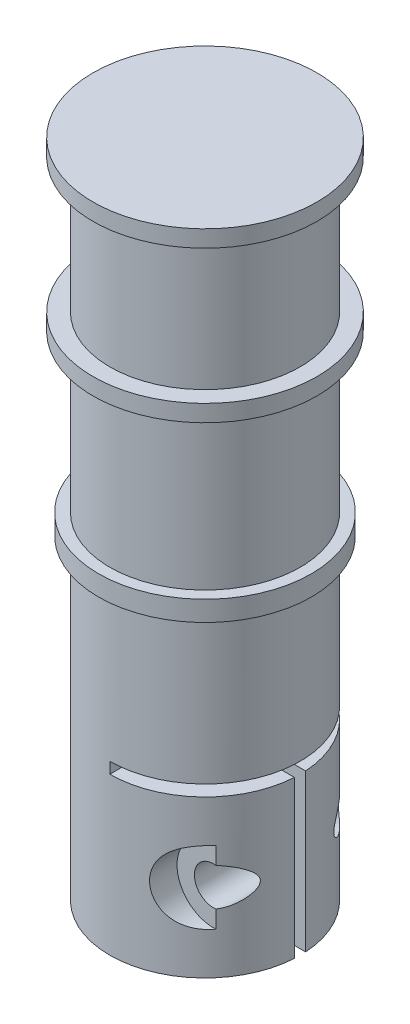
ISO-10303-21;
HEADER;
FILE_DESCRIPTION(('STEP AP214'),'2;1');
FILE_NAME('part.step','',(''),(''),'','','');
FILE_SCHEMA(('AUTOMOTIVE_DESIGN { 1 0 10303 214 1 1 1 1 }'));
ENDSEC;
DATA;
#1=APPLICATION_CONTEXT('core data for automotive mechanical design processes');
#2=APPLICATION_PROTOCOL_DEFINITION('international standard','automotive_design',2000,#1);
#3=PRODUCT_CONTEXT('',#1,'mechanical');
#4=PRODUCT('Part','Part','',(#3));
#5=PRODUCT_RELATED_PRODUCT_CATEGORY('part','',(#4));
#6=PRODUCT_DEFINITION_FORMATION('','',#4);
#7=PRODUCT_DEFINITION_CONTEXT('part definition',#1,'design');
#8=PRODUCT_DEFINITION('design','',#6,#7);
#9=PRODUCT_DEFINITION_SHAPE('','',#8);
#10=(LENGTH_UNIT() NAMED_UNIT(*) SI_UNIT(.MILLI.,.METRE.));
#11=(NAMED_UNIT(*) PLANE_ANGLE_UNIT() SI_UNIT($,.RADIAN.));
#12=(NAMED_UNIT(*) SI_UNIT($,.STERADIAN.) SOLID_ANGLE_UNIT());
#13=UNCERTAINTY_MEASURE_WITH_UNIT(LENGTH_MEASURE(1.E-05),#10,'distance_accuracy_value','');
#14=(GEOMETRIC_REPRESENTATION_CONTEXT(3) GLOBAL_UNCERTAINTY_ASSIGNED_CONTEXT((#13)) GLOBAL_UNIT_ASSIGNED_CONTEXT((#10,
#11,#12)) REPRESENTATION_CONTEXT('',''));
#15=CARTESIAN_POINT('',(0.,0.,0.));
#16=DIRECTION('',(0.,0.,1.));
#17=DIRECTION('',(1.,0.,0.));
#18=AXIS2_PLACEMENT_3D('',#15,#16,#17);
#19=CARTESIAN_POINT('',(0.,15.,0.));
#20=DIRECTION('',(0.,1.,0.));
#21=DIRECTION('',(-1.,0.,0.));
#22=AXIS2_PLACEMENT_3D('',#19,#20,#21);
#23=CYLINDRICAL_SURFACE('',#22,8.49999999999999);
#24=CARTESIAN_POINT('',(7.49999999999999,-37.,-4.));
#25=CARTESIAN_POINT('',(7.50000104173106,-37.0362621084396,-3.99999781244888));
#26=CARTESIAN_POINT('',(7.49840667362942,-37.0725178735861,-4.00299165296323));
#27=CARTESIAN_POINT('',(7.4922112444708,-37.1438669581623,-4.01457496538662));
#28=CARTESIAN_POINT('',(7.48760654982766,-37.1789588188573,-4.02317119957305));
#29=CARTESIAN_POINT('',(7.47421892105926,-37.2563609485364,-4.04799895786751));
#30=CARTESIAN_POINT('',(7.46464402000119,-37.2980652831181,-4.06566450341244));
#31=CARTESIAN_POINT('',(7.44227788080236,-37.3777505180664,-4.10646370496002));
#32=CARTESIAN_POINT('',(7.42947955493187,-37.4157229534613,-4.12960940402044));
#33=CARTESIAN_POINT('',(7.39212753270202,-37.5120774238403,-4.19627210145248));
#34=CARTESIAN_POINT('',(7.3654086042779,-37.5672832733205,-4.24311553758888));
#35=CARTESIAN_POINT('',(7.30726581959389,-37.6694405690026,-4.34249017554281));
#36=CARTESIAN_POINT('',(7.27582834977834,-37.7163672474147,-4.39503770879502));
#37=CARTESIAN_POINT('',(7.21228202415956,-37.7993646960558,-4.49848181530906));
#38=CARTESIAN_POINT('',(7.1804894962976,-37.8360328690112,-4.54909978569364));
#39=CARTESIAN_POINT('',(7.11425252927633,-37.9043409617399,-4.65200614975663));
#40=CARTESIAN_POINT('',(7.07980608442306,-37.935977022058,-4.70429578898584));
#41=CARTESIAN_POINT('',(7.00850601757651,-37.9946354883093,-4.80987585764598));
#42=CARTESIAN_POINT('',(6.97165042416338,-38.0216540486889,-4.86316708061864));
#43=CARTESIAN_POINT('',(6.89571735445522,-38.0712638567762,-4.97025098716958));
#44=CARTESIAN_POINT('',(6.85663901555579,-38.0938533703235,-5.02404385856329));
#45=CARTESIAN_POINT('',(6.77384906822523,-38.1359459087546,-5.13517915096006));
#46=CARTESIAN_POINT('',(6.73000086915312,-38.1551609959873,-5.19252958775169));
#47=CARTESIAN_POINT('',(6.6401163129894,-38.1885318357772,-5.30699261806551));
#48=CARTESIAN_POINT('',(6.59407912472238,-38.2026856488671,-5.36410511214082));
#49=CARTESIAN_POINT('',(6.45305541606281,-38.2371879924718,-5.53440723394654));
#50=CARTESIAN_POINT('',(6.35496466513853,-38.2496761115152,-5.64682060160865));
#51=CARTESIAN_POINT('',(6.17439936486854,-38.2502439107989,-5.84300112065261));
#52=CARTESIAN_POINT('',(6.09302864269555,-38.2429412301143,-5.92778466282494));
#53=CARTESIAN_POINT('',(5.92852467994704,-38.2108494749952,-6.09229253889131));
#54=CARTESIAN_POINT('',(5.84539376802425,-38.1860822553869,-6.17202306028495));
#55=CARTESIAN_POINT('',(5.70059033723997,-38.1248313189851,-6.30559519044186));
#56=CARTESIAN_POINT('',(5.6385893975122,-38.0926284486185,-6.3610352610118));
#57=CARTESIAN_POINT('',(5.51766673525498,-38.0155348431326,-6.46619940588375));
#58=CARTESIAN_POINT('',(5.45874082011857,-37.9706619483235,-6.51593138008959));
#59=CARTESIAN_POINT('',(5.35807758169123,-37.8778855132298,-6.59881740625611));
#60=CARTESIAN_POINT('',(5.31525229757367,-37.832358890401,-6.63330151922288));
#61=CARTESIAN_POINT('',(5.23539867557234,-37.7329009522418,-6.69650583288952));
#62=CARTESIAN_POINT('',(5.198368916813,-37.6789717034543,-6.72522744685631));
#63=CARTESIAN_POINT('',(5.13196510357456,-37.5630225710897,-6.77603913470735));
#64=CARTESIAN_POINT('',(5.10265595329049,-37.50094028678,-6.79807321028622));
#65=CARTESIAN_POINT('',(5.05423611398133,-37.3707507370513,-6.83415124160174));
#66=CARTESIAN_POINT('',(5.03511609576597,-37.3026490498619,-6.84820250719748));
#67=CARTESIAN_POINT('',(5.01048837764339,-37.1727861276534,-6.86623647879438));
#68=CARTESIAN_POINT('',(5.00345209575366,-37.1114683468377,-6.87135160299379));
#69=CARTESIAN_POINT('',(4.99853882774815,-36.9882846481297,-6.87492707871364));
#70=CARTESIAN_POINT('',(5.00065731522876,-36.9264190162089,-6.8733907189346));
#71=CARTESIAN_POINT('',(5.01340800108481,-36.8087254558467,-6.86409439142262));
#72=CARTESIAN_POINT('',(5.0234006938712,-36.7527887716898,-6.85680184189314));
#73=CARTESIAN_POINT('',(5.05053873302633,-36.643696443313,-6.83683698910607));
#74=CARTESIAN_POINT('',(5.06768405535246,-36.5905407897458,-6.82416470393174));
#75=CARTESIAN_POINT('',(5.10886206775014,-36.4866564367939,-6.793394156475));
#76=CARTESIAN_POINT('',(5.13308811273957,-36.4360504707735,-6.77514279592334));
#77=CARTESIAN_POINT('',(5.18703406032118,-36.3399672326361,-6.73393113000013));
#78=CARTESIAN_POINT('',(5.21675575436518,-36.2944916407055,-6.7109692888552));
#79=CARTESIAN_POINT('',(5.28419063043361,-36.2042346881331,-6.65803012377406));
#80=CARTESIAN_POINT('',(5.3224308690305,-36.1601455634109,-6.62754801058209));
#81=CARTESIAN_POINT('',(5.40269398714768,-36.0792243697112,-6.56228507533677));
#82=CARTESIAN_POINT('',(5.44471927201626,-36.042396963546,-6.52750151445682));
#83=CARTESIAN_POINT('',(5.55274186168493,-35.9593262062551,-6.43616336746569));
#84=CARTESIAN_POINT('',(5.62027090768463,-35.9175024721522,-6.37738167815104));
#85=CARTESIAN_POINT('',(5.75739831460052,-35.8485830860379,-6.25387492403769));
#86=CARTESIAN_POINT('',(5.82700097163851,-35.8215206321692,-6.1891368420171));
#87=CARTESIAN_POINT('',(5.99072776111881,-35.7732399728367,-6.03143740564573));
#88=CARTESIAN_POINT('',(6.08472654411135,-35.7575659660023,-5.93665738848719));
#89=CARTESIAN_POINT('',(6.26858278407944,-35.7467413680663,-5.74220166681259));
#90=CARTESIAN_POINT('',(6.35843606764413,-35.7516110220113,-5.64252122873214));
#91=CARTESIAN_POINT('',(6.53451324420034,-35.7794627875578,-5.43772565022469));
#92=CARTESIAN_POINT('',(6.62057043392493,-35.8029371065782,-5.33253643444297));
#93=CARTESIAN_POINT('',(6.78519078543556,-35.8669134073465,-5.1214372668176));
#94=CARTESIAN_POINT('',(6.86375045273507,-35.9074232820241,-5.01552700330373));
#95=CARTESIAN_POINT('',(7.00174988190731,-35.9984018873618,-4.82054175206055));
#96=CARTESIAN_POINT('',(7.0623170038023,-36.0466160614587,-4.73122636219827));
#97=CARTESIAN_POINT('',(7.14768573984286,-36.1292443006697,-4.60036023434416));
#98=CARTESIAN_POINT('',(7.17520955091929,-36.1584788434754,-4.5572874676121));
#99=CARTESIAN_POINT('',(7.22823965650707,-36.220755561201,-4.4726987418679));
#100=CARTESIAN_POINT('',(7.25374725406791,-36.2537952424189,-4.43118178663555));
#101=CARTESIAN_POINT('',(7.30257100015479,-36.3243906658561,-4.35025311587033));
#102=CARTESIAN_POINT('',(7.32587426030963,-36.3619703540784,-4.31085430117033));
#103=CARTESIAN_POINT('',(7.36958026475151,-36.4422121718066,-4.23570151483973));
#104=CARTESIAN_POINT('',(7.38998437029159,-36.4848718986488,-4.19994583487776));
#105=CARTESIAN_POINT('',(7.42308741569309,-36.5665477482065,-4.14109506502641));
#106=CARTESIAN_POINT('',(7.43650617062265,-36.604474382738,-4.11691377773471));
#107=CARTESIAN_POINT('',(7.46016026129789,-36.6841958442748,-4.07389382891817));
#108=CARTESIAN_POINT('',(7.47040088451753,-36.7259840946945,-4.05504629825063));
#109=CARTESIAN_POINT('',(7.48544114046758,-36.8061596444812,-4.02720555597096));
#110=CARTESIAN_POINT('',(7.49084351842495,-36.8440467735246,-4.01712814277112));
#111=CARTESIAN_POINT('',(7.49811910167592,-36.9212936768637,-4.00353265026437));
#112=CARTESIAN_POINT('',(7.49999886957702,-36.9606505731299,-4.00000237379696));
#113=CARTESIAN_POINT('',(7.49999999999999,-37.,-4.));
#114=B_SPLINE_CURVE_WITH_KNOTS('',3,(#24,#25,#26,#27,#28,#29,#30,#31,#32,#33,#34,#35,#36,#37,
#38,#39,#40,#41,#42,#43,#44,#45,#46,#47,#48,#49,#50,#51,#52,#53,#54,#55,#56,#57,#58,#59,#60,#61,
#62,#63,#64,#65,#66,#67,#68,#69,#70,#71,#72,#73,#74,#75,#76,#77,#78,#79,#80,#81,#82,#83,#84,#85,
#86,#87,#88,#89,#90,#91,#92,#93,#94,#95,#96,#97,#98,#99,#100,#101,#102,#103,#104,#105,#106,#107,
#108,#109,#110,#111,#112,#113),.UNSPECIFIED.,.T.,.F.,(4,2,2,2,2,2,2,2,2,2,2,2,2,2,2,2,2,2,2,2,2,
2,2,2,2,2,2,2,2,2,2,2,2,2,2,2,2,2,2,2,2,2,2,2,4),(0.,0.108627841931911,0.217387044763668,
0.355480686728664,0.493880663816299,0.724114861302255,0.955026555627364,1.16511029132739,
1.37535438501107,1.585772730164,1.79627329925757,2.02017100242012,2.24415441090626,
2.69111877615121,3.04322575071176,3.39489288476153,3.66153096612826,3.92779545825068,
4.14111402139969,4.35438020352698,4.5693858114606,4.78419422010563,4.96899157944719,
5.15369757966546,5.3247794861173,5.49586081750477,5.67213786911111,5.84847248450242,
6.0452585516726,6.24217056831914,6.53696697995982,6.83242368385965,7.23346075642922,
7.63489312903081,8.04731534635553,8.45992885842364,8.81349931324163,8.99001735737939,
9.16642037150797,9.34379815350181,9.52109237332515,9.66148768716016,9.8016481566834,
9.91974469371171,10.0376209978232),.UNSPECIFIED.);
#115=CARTESIAN_POINT('',(7.49999999999999,-37.,-4.));
#116=VERTEX_POINT('',#115);
#117=EDGE_CURVE('E196',#116,#116,#114,.T.);
#118=ORIENTED_EDGE('',*,*,#117,.F.);
#119=EDGE_LOOP('',(#118));
#120=FACE_BOUND('',#119,.T.);
#121=CARTESIAN_POINT('',(6.48074069840786,-38.6842680101748,5.49999999999999));
#122=CARTESIAN_POINT('',(6.55611816546375,-38.6738940397108,5.41120454659807));
#123=CARTESIAN_POINT('',(6.62932673424867,-38.6587587307861,5.3212197384869));
#124=CARTESIAN_POINT('',(6.77112216530122,-38.6198372704677,5.13956270681997));
#125=CARTESIAN_POINT('',(6.83971147297199,-38.5960557396736,5.04789140933164));
#126=CARTESIAN_POINT('',(6.97239642556038,-38.5405623292365,4.86299532945132));
#127=CARTESIAN_POINT('',(7.03646787969987,-38.5088113809051,4.76976507046695));
#128=CARTESIAN_POINT('',(7.15962820054476,-38.4379254730638,4.58282045870865));
#129=CARTESIAN_POINT('',(7.21871708804112,-38.3987905443678,4.48910610795644));
#130=CARTESIAN_POINT('',(7.3202601746031,-38.3220149146788,4.32103782618296));
#131=CARTESIAN_POINT('',(7.36364751005511,-38.2857005396767,4.24663765972935));
#132=CARTESIAN_POINT('',(7.44713808064626,-38.208346364181,4.09845851645849));
#133=CARTESIAN_POINT('',(7.48724174413842,-38.1673071817216,4.02467945974801));
#134=CARTESIAN_POINT('',(7.56408693639801,-38.0800739540819,3.87832661036858));
#135=CARTESIAN_POINT('',(7.60082628881743,-38.0338766144092,3.80575362239404));
#136=CARTESIAN_POINT('',(7.6706619525844,-37.9356037543441,3.66295757129935));
#137=CARTESIAN_POINT('',(7.70376146907812,-37.8835334886994,3.59273247923393));
#138=CARTESIAN_POINT('',(7.76605265833248,-37.7718227425633,3.45601568052034));
#139=CARTESIAN_POINT('',(7.79523010444388,-37.7121561541262,3.38953804771534));
#140=CARTESIAN_POINT('',(7.83506510654143,-37.6154384586479,3.29589387730697));
#141=CARTESIAN_POINT('',(7.84766390734599,-37.5820806566682,3.26575319999064));
#142=CARTESIAN_POINT('',(7.87131946907042,-37.5125179095576,3.20831519943126));
#143=CARTESIAN_POINT('',(7.88237818223203,-37.4763166616219,3.18101428777671));
#144=CARTESIAN_POINT('',(7.90135521084898,-37.4052263617858,3.13355382548861));
#145=CARTESIAN_POINT('',(7.90949177012274,-37.3707112532838,3.1129296931999));
#146=CARTESIAN_POINT('',(7.92390002737567,-37.2989895210961,3.07606894935766));
#147=CARTESIAN_POINT('',(7.93017193272207,-37.2617831972718,3.05983184994273));
#148=CARTESIAN_POINT('',(7.94042556880578,-37.1843923534197,3.03312597786504));
#149=CARTESIAN_POINT('',(7.94437472858958,-37.1441740007327,3.022739325223));
#150=CARTESIAN_POINT('',(7.94934706402133,-37.0623506638658,3.00964059920819));
#151=CARTESIAN_POINT('',(7.95037638273462,-37.0207487774852,3.00691241328264));
#152=CARTESIAN_POINT('',(7.9494369939074,-36.9432497668179,3.0093934204881));
#153=CARTESIAN_POINT('',(7.9478394619839,-36.9073119086193,3.01361996407728));
#154=CARTESIAN_POINT('',(7.94250966273654,-36.836694299237,3.0276385735659));
#155=CARTESIAN_POINT('',(7.93877456111508,-36.8020162835879,3.03743802872509));
#156=CARTESIAN_POINT('',(7.92761320267342,-36.7208823625087,3.06647575940374));
#157=CARTESIAN_POINT('',(7.91930421961047,-36.6753557658469,3.08793043467904));
#158=CARTESIAN_POINT('',(7.90001479110681,-36.5883553157434,3.13695077172809));
#159=CARTESIAN_POINT('',(7.88902717263975,-36.5468927703968,3.16453282389469));
#160=CARTESIAN_POINT('',(7.86562115179767,-36.469609029423,3.2222549813633));
#161=CARTESIAN_POINT('',(7.85330013018344,-36.4336104045639,3.25220164742888));
#162=CARTESIAN_POINT('',(7.82715871727674,-36.3644405441142,3.31462485810221));
#163=CARTESIAN_POINT('',(7.81333690754607,-36.3312720371502,3.34710378770771));
#164=CARTESIAN_POINT('',(7.76989544085221,-36.2352203673734,3.44731828866171));
#165=CARTESIAN_POINT('',(7.73835673132278,-36.1759670112994,3.51768874213246));
#166=CARTESIAN_POINT('',(7.6678401976605,-36.0593640380882,3.66904653643035));
#167=CARTESIAN_POINT('',(7.62843639608595,-36.0027683642286,3.75039889109588));
#168=CARTESIAN_POINT('',(7.54505543084022,-35.8966504215791,3.91544390657919));
#169=CARTESIAN_POINT('',(7.5010736280864,-35.8471354509446,3.99913887724921));
#170=CARTESIAN_POINT('',(7.408785637013,-35.7544112305105,4.16762894715512));
#171=CARTESIAN_POINT('',(7.36047872971706,-35.7112030322581,4.25242422728834));
#172=CARTESIAN_POINT('',(7.25965237555027,-35.6307818993678,4.42235337607952));
#173=CARTESIAN_POINT('',(7.20713285028908,-35.5935690763333,4.50748725101019));
#174=CARTESIAN_POINT('',(7.10301890082823,-35.5283435963557,4.66963888697249));
#175=CARTESIAN_POINT('',(7.0517900492913,-35.4997978609354,4.74667741948705));
#176=CARTESIAN_POINT('',(6.94599149123303,-35.4478832727311,4.90019315830441));
#177=CARTESIAN_POINT('',(6.89142222907825,-35.4245137332725,4.97667043776006));
#178=CARTESIAN_POINT('',(6.77928673642157,-35.3833959542859,5.12836378681262));
#179=CARTESIAN_POINT('',(6.72173596724288,-35.365621549299,5.2035841208017));
#180=CARTESIAN_POINT('',(6.60352547726178,-35.3360540988459,5.35280766211307));
#181=CARTESIAN_POINT('',(6.54286408777785,-35.3242643015539,5.42681018742716));
#182=CARTESIAN_POINT('',(6.48074069840786,-35.3157319898252,5.5));
#183=B_SPLINE_CURVE_WITH_KNOTS('',3,(#121,#122,#123,#124,#125,#126,#127,#128,#129,#130,#131,
#132,#133,#134,#135,#136,#137,#138,#139,#140,#141,#142,#143,#144,#145,#146,#147,#148,#149,#150,
#151,#152,#153,#154,#155,#156,#157,#158,#159,#160,#161,#162,#163,#164,#165,#166,#167,#168,#169,
#170,#171,#172,#173,#174,#175,#176,#177,#178,#179,#180,#181,#182),.UNSPECIFIED.,.F.,.F.,(4,2,2,
2,2,2,2,2,2,2,2,2,2,2,2,2,2,2,2,2,2,2,2,2,2,2,2,2,2,2,4),(0.,0.350579743570745,
0.700972409676336,1.05311756214206,1.40526124512323,1.68550659188278,1.96571532236893,
2.246104055888,2.52624387503456,2.80737390745544,2.94730087011535,3.08704881221782,
3.20983674786863,3.33261102322227,3.45706822306162,3.58126338199319,3.68936648532844,
3.79761326052324,3.94977481090925,4.10234839381312,4.24739173755096,4.39257337923426,
4.68363119249959,5.00317621118113,5.32304825033961,5.64297356195692,5.962904828273,
6.25317795719592,6.54341255536568,6.83226899291597,7.12128204148418),.UNSPECIFIED.);
#184=CARTESIAN_POINT('',(6.48074069840786,-38.6842680101748,5.49999999999999));
#185=VERTEX_POINT('',#184);
#186=CARTESIAN_POINT('',(6.48074069840786,-35.3157319898252,5.49999999999999));
#187=VERTEX_POINT('',#186);
#188=EDGE_CURVE('E262',#185,#187,#183,.T.);
#189=ORIENTED_EDGE('',*,*,#188,.F.);
#190=DIRECTION('',(0.,1.,0.));
#191=VECTOR('',#190,1.);
#192=CARTESIAN_POINT('',(6.48074069840786,15.,5.49999999999999));
#193=LINE('',#192,#191);
#194=CARTESIAN_POINT('',(6.48074069840786,-40.2417986874725,5.49999999999999));
#195=VERTEX_POINT('',#194);
#196=EDGE_CURVE('E269',#195,#185,#193,.T.);
#197=ORIENTED_EDGE('',*,*,#196,.F.);
#198=CARTESIAN_POINT('',(6.48074069840786,-33.7582013125275,5.49999999999999));
#199=CARTESIAN_POINT('',(6.39218335690009,-33.7519046374032,5.60438271611653));
#200=CARTESIAN_POINT('',(6.30091648859682,-33.7490517705313,5.7067804207422));
#201=CARTESIAN_POINT('',(6.11339786837919,-33.7515130167343,5.907211085162));
#202=CARTESIAN_POINT('',(6.01713551861437,-33.7568452410043,6.00523387033762));
#203=CARTESIAN_POINT('',(5.81969389855974,-33.777073622415,6.19679345256202));
#204=CARTESIAN_POINT('',(5.71848222648166,-33.7920437942068,6.29028945983473));
#205=CARTESIAN_POINT('',(5.51296502602968,-33.8329445221217,6.47116001422039));
#206=CARTESIAN_POINT('',(5.40866258119846,-33.8588644751035,6.55854038819628));
#207=CARTESIAN_POINT('',(5.22744167916603,-33.9140321404776,6.70323394900126));
#208=CARTESIAN_POINT('',(5.15093205372714,-33.9403743895915,6.7621764610181));
#209=CARTESIAN_POINT('',(4.99768657118082,-33.9998396710046,6.87620834109847));
#210=CARTESIAN_POINT('',(4.92095077565157,-34.0329610003391,6.93129867220986));
#211=CARTESIAN_POINT('',(4.76825219658715,-34.1062011639769,7.03721398410479));
#212=CARTESIAN_POINT('',(4.69228779649567,-34.1462989781005,7.08805111715692));
#213=CARTESIAN_POINT('',(4.54181843881244,-34.2337421322492,7.18539562978765));
#214=CARTESIAN_POINT('',(4.46731280285868,-34.2810840087494,7.2319050615238));
#215=CARTESIAN_POINT('',(4.32007436300001,-34.3835147438389,7.32082070774669));
#216=CARTESIAN_POINT('',(4.24736139968943,-34.4386646257198,7.36318967219516));
#217=CARTESIAN_POINT('',(4.10541941295403,-34.556280627803,7.44326340401181));
#218=CARTESIAN_POINT('',(4.0361888288512,-34.6187434280899,7.48097027201374));
#219=CARTESIAN_POINT('',(3.90215240644323,-34.7507847470767,7.55175198447325));
#220=CARTESIAN_POINT('',(3.83735045680482,-34.8203693887256,7.58482278423783));
#221=CARTESIAN_POINT('',(3.71323945879826,-34.9661593799682,7.64634893457018));
#222=CARTESIAN_POINT('',(3.65392982593475,-35.0423640233809,7.674804776507));
#223=CARTESIAN_POINT('',(3.54773096248661,-35.1923061160367,7.72442004822106));
#224=CARTESIAN_POINT('',(3.50019180260778,-35.2654341959827,7.74603448080891));
#225=CARTESIAN_POINT('',(3.41078579577023,-35.4160075937115,7.78581629869267));
#226=CARTESIAN_POINT('',(3.36892082757701,-35.4934543295105,7.8039825430622));
#227=CARTESIAN_POINT('',(3.29141663341272,-35.6520156844412,7.83698625463953));
#228=CARTESIAN_POINT('',(3.25577284354519,-35.7331275593413,7.85182616435891));
#229=CARTESIAN_POINT('',(3.19108124745898,-35.8984500509981,7.87833824433541));
#230=CARTESIAN_POINT('',(3.162035856835,-35.9826617895096,7.8900092548008));
#231=CARTESIAN_POINT('',(3.08760922793677,-36.2313975817491,7.91956496870842));
#232=CARTESIAN_POINT('',(3.05141238177937,-36.3992750437296,7.93344038703209));
#233=CARTESIAN_POINT('',(3.00595250234872,-36.7390679712126,7.95077601490431));
#234=CARTESIAN_POINT('',(2.99668839633677,-36.9109832756117,7.95423663927726));
#235=CARTESIAN_POINT('',(3.0053901882309,-37.2533878066819,7.95095284925549));
#236=CARTESIAN_POINT('',(3.02325213347021,-37.4238799725992,7.94424739355846));
#237=CARTESIAN_POINT('',(3.08532748877057,-37.7592284563654,7.92034384076964));
#238=CARTESIAN_POINT('',(3.12953989839541,-37.9240849879288,7.90314614203151));
#239=CARTESIAN_POINT('',(3.24252009031983,-38.2434830547091,7.85746461721718));
#240=CARTESIAN_POINT('',(3.31128582148173,-38.3980254502698,7.82898173386199));
#241=CARTESIAN_POINT('',(3.47044192728459,-38.6925024110125,7.75973754480475));
#242=CARTESIAN_POINT('',(3.56083012281351,-38.8324384461836,7.71897747629028));
#243=CARTESIAN_POINT('',(3.75966025393442,-39.0947336376151,7.62411284124513));
#244=CARTESIAN_POINT('',(3.86817877859004,-39.2170139415261,7.56995117371094));
#245=CARTESIAN_POINT('',(4.09809767269997,-39.440812889057,7.44798608484854));
#246=CARTESIAN_POINT('',(4.2194979632855,-39.5423316597785,7.38018274703937));
#247=CARTESIAN_POINT('',(4.47494707425829,-39.727183480652,7.22826195888618));
#248=CARTESIAN_POINT('',(4.60930606814701,-39.8096400453678,7.14360599378746));
#249=CARTESIAN_POINT('',(4.88099734239058,-39.9515860820823,6.96079548837146));
#250=CARTESIAN_POINT('',(5.01833176065393,-40.0110584196233,6.86263095122259));
#251=CARTESIAN_POINT('',(5.25034975660141,-40.0941105747946,6.6856814507426));
#252=CARTESIAN_POINT('',(5.3454731149917,-40.1231056128658,6.60991282375827));
#253=CARTESIAN_POINT('',(5.53380743546785,-40.1715960054837,6.45305983529048));
#254=CARTESIAN_POINT('',(5.62701755112699,-40.1910872387266,6.37197318491923));
#255=CARTESIAN_POINT('',(5.81056672360319,-40.2214998236316,6.20505611340838));
#256=CARTESIAN_POINT('',(5.90090464888269,-40.2324178369366,6.11922385827227));
#257=CARTESIAN_POINT('',(6.07800665163848,-40.2466613081777,5.94334983286286));
#258=CARTESIAN_POINT('',(6.16477059444096,-40.249986480259,5.85330790423425));
#259=CARTESIAN_POINT('',(6.28898978791024,-40.2500062448143,5.71856705131657));
#260=CARTESIAN_POINT('',(6.32804781315402,-40.2492924362001,5.67531549409514));
#261=CARTESIAN_POINT('',(6.40513913330868,-40.2465234389162,5.58816310792638));
#262=CARTESIAN_POINT('',(6.44317496140782,-40.2444719619852,5.54426440314375));
#263=CARTESIAN_POINT('',(6.48074069840786,-40.2417986874725,5.49999999999999));
#264=B_SPLINE_CURVE_WITH_KNOTS('',3,(#198,#199,#200,#201,#202,#203,#204,#205,#206,#207,#208,
#209,#210,#211,#212,#213,#214,#215,#216,#217,#218,#219,#220,#221,#222,#223,#224,#225,#226,#227,
#228,#229,#230,#231,#232,#233,#234,#235,#236,#237,#238,#239,#240,#241,#242,#243,#244,#245,#246,
#247,#248,#249,#250,#251,#252,#253,#254,#255,#256,#257,#258,#259,#260,#261,#262,#263),
.UNSPECIFIED.,.F.,.F.,(4,2,2,2,2,2,2,2,2,2,2,2,2,2,2,2,2,2,2,2,2,2,2,2,2,2,2,2,2,2,2,2,4),(0.,
0.411135273858625,0.823181581169773,1.23843056672403,1.65327836732241,1.95333389078215,
2.25331412995656,2.55240570330948,2.85135471951875,3.15278435645194,3.45407767728267,
3.75563224410008,4.05715468234639,4.32639479163922,4.59572383160659,4.86485445191504,
5.13408343950608,5.64829256596691,6.16248121105124,6.6747043446826,7.18690803220775,
7.6990689412203,8.21117825638353,8.72550829773646,9.23983519027841,9.77447318270845,
10.3095089758606,10.6840963248449,11.0588459686518,11.4337414653134,11.8086510757852,
11.9834730989779,12.1578120815926),.UNSPECIFIED.);
#265=CARTESIAN_POINT('',(6.48074069840786,-33.7582013125275,5.49999999999999));
#266=VERTEX_POINT('',#265);
#267=EDGE_CURVE('E254',#266,#195,#264,.T.);
#268=ORIENTED_EDGE('',*,*,#267,.F.);
#269=EDGE_CURVE('E270',#187,#266,#193,.T.);
#270=ORIENTED_EDGE('',*,*,#269,.F.);
#271=EDGE_LOOP('',(#189,#197,#268,#270));
#272=FACE_BOUND('',#271,.T.);
#273=CARTESIAN_POINT('',(0.,-15.8,0.));
#274=DIRECTION('',(0.,1.,0.));
#275=DIRECTION('',(-1.,0.,0.));
#276=AXIS2_PLACEMENT_3D('',#273,#274,#275);
#277=CIRCLE('',#276,8.49999999999999);
#278=CARTESIAN_POINT('',(-8.49999999999999,-15.8,0.));
#279=VERTEX_POINT('',#278);
#280=EDGE_CURVE('E330',#279,#279,#277,.T.);
#281=ORIENTED_EDGE('',*,*,#280,.F.);
#282=EDGE_LOOP('',(#281));
#283=FACE_BOUND('',#282,.T.);
#284=DIRECTION('',(0.,1.,0.));
#285=VECTOR('',#284,1.);
#286=CARTESIAN_POINT('',(0.,15.,-8.49999999999999));
#287=LINE('',#286,#285);
#288=CARTESIAN_POINT('',(0.,-29.,-8.49999999999999));
#289=VERTEX_POINT('',#288);
#290=CARTESIAN_POINT('',(0.,-30.,-8.49999999999999));
#291=VERTEX_POINT('',#290);
#292=EDGE_CURVE('E141',#289,#291,#287,.F.);
#293=ORIENTED_EDGE('',*,*,#292,.T.);
#294=CARTESIAN_POINT('',(0.,-30.,0.));
#295=DIRECTION('',(0.,1.,0.));
#296=DIRECTION('',(0.,0.,1.));
#297=AXIS2_PLACEMENT_3D('',#294,#295,#296);
#298=CIRCLE('',#297,8.49999999999999);
#299=CARTESIAN_POINT('',(8.48528137423856,-30.,-0.5));
#300=VERTEX_POINT('',#299);
#301=EDGE_CURVE('E142',#291,#300,#298,.F.);
#302=ORIENTED_EDGE('',*,*,#301,.T.);
#303=DIRECTION('',(0.,1.,0.));
#304=VECTOR('',#303,1.);
#305=CARTESIAN_POINT('',(8.48528137423856,15.,-0.5));
#306=LINE('',#305,#304);
#307=CARTESIAN_POINT('',(8.48528137423856,-44.,-0.5));
#308=VERTEX_POINT('',#307);
#309=EDGE_CURVE('E179',#300,#308,#306,.F.);
#310=ORIENTED_EDGE('',*,*,#309,.T.);
#311=CARTESIAN_POINT('',(0.,-44.,0.));
#312=DIRECTION('',(0.,1.,0.));
#313=DIRECTION('',(-1.,0.,0.));
#314=AXIS2_PLACEMENT_3D('',#311,#312,#313);
#315=CIRCLE('',#314,8.49999999999999);
#316=CARTESIAN_POINT('',(-8.48528137423856,-44.,-0.5));
#317=VERTEX_POINT('',#316);
#318=EDGE_CURVE('E339',#308,#317,#315,.T.);
#319=ORIENTED_EDGE('',*,*,#318,.T.);
#320=DIRECTION('',(0.,1.,0.));
#321=VECTOR('',#320,1.);
#322=CARTESIAN_POINT('',(-8.48528137423856,15.,-0.5));
#323=LINE('',#322,#321);
#324=CARTESIAN_POINT('',(-8.48528137423856,-30.,-0.5));
#325=VERTEX_POINT('',#324);
#326=EDGE_CURVE('E168',#317,#325,#323,.T.);
#327=ORIENTED_EDGE('',*,*,#326,.T.);
#328=CARTESIAN_POINT('',(0.,-30.,0.));
#329=DIRECTION('',(0.,1.,0.));
#330=DIRECTION('',(0.,0.,1.));
#331=AXIS2_PLACEMENT_3D('',#328,#329,#330);
#332=CIRCLE('',#331,8.49999999999999);
#333=CARTESIAN_POINT('',(-8.48528137423856,-30.,0.5));
#334=VERTEX_POINT('',#333);
#335=EDGE_CURVE('E44',#334,#325,#332,.F.);
#336=ORIENTED_EDGE('',*,*,#335,.F.);
#337=DIRECTION('',(0.,1.,0.));
#338=VECTOR('',#337,1.);
#339=CARTESIAN_POINT('',(-8.48528137423856,15.,0.5));
#340=LINE('',#339,#338);
#341=CARTESIAN_POINT('',(-8.48528137423856,-44.,0.5));
#342=VERTEX_POINT('',#341);
#343=EDGE_CURVE('E186',#342,#334,#340,.T.);
#344=ORIENTED_EDGE('',*,*,#343,.F.);
#345=CARTESIAN_POINT('',(8.48528137423856,-44.,0.5));
#346=VERTEX_POINT('',#345);
#347=EDGE_CURVE('E340',#342,#346,#315,.T.);
#348=ORIENTED_EDGE('',*,*,#347,.T.);
#349=DIRECTION('',(0.,1.,0.));
#350=VECTOR('',#349,1.);
#351=CARTESIAN_POINT('',(8.48528137423856,15.,0.5));
#352=LINE('',#351,#350);
#353=CARTESIAN_POINT('',(8.48528137423856,-30.,0.5));
#354=VERTEX_POINT('',#353);
#355=EDGE_CURVE('E153',#354,#346,#352,.F.);
#356=ORIENTED_EDGE('',*,*,#355,.F.);
#357=CARTESIAN_POINT('',(0.,-30.,8.49999999999999));
#358=VERTEX_POINT('',#357);
#359=EDGE_CURVE('E51',#354,#358,#298,.F.);
#360=ORIENTED_EDGE('',*,*,#359,.T.);
#361=DIRECTION('',(0.,1.,0.));
#362=VECTOR('',#361,1.);
#363=CARTESIAN_POINT('',(0.,15.,8.49999999999999));
#364=LINE('',#363,#362);
#365=CARTESIAN_POINT('',(0.,-29.,8.49999999999999));
#366=VERTEX_POINT('',#365);
#367=EDGE_CURVE('E132',#358,#366,#364,.T.);
#368=ORIENTED_EDGE('',*,*,#367,.T.);
#369=CARTESIAN_POINT('',(0.,-29.,0.));
#370=DIRECTION('',(0.,1.,0.));
#371=DIRECTION('',(0.,0.,1.));
#372=AXIS2_PLACEMENT_3D('',#369,#370,#371);
#373=CIRCLE('',#372,8.49999999999999);
#374=EDGE_CURVE('E11',#289,#366,#373,.F.);
#375=ORIENTED_EDGE('',*,*,#374,.F.);
#376=EDGE_LOOP('',(#293,#302,#310,#319,#327,#336,#344,#348,#356,#360,#368,#375));
#377=FACE_BOUND('',#376,.T.);
#378=ADVANCED_FACE('F36',(#120,#272,#283,#377),#23,.T.);
#379=CARTESIAN_POINT('',(0.,-30.,0.));
#380=DIRECTION('',(0.,-1.,0.));
#381=DIRECTION('',(1.,0.,0.));
#382=AXIS2_PLACEMENT_3D('',#379,#380,#381);
#383=PLANE('',#382);
#384=CARTESIAN_POINT('',(0.,-30.,0.));
#385=DIRECTION('',(0.,1.,0.));
#386=DIRECTION('',(-1.,0.,0.));
#387=AXIS2_PLACEMENT_3D('',#384,#385,#386);
#388=CIRCLE('',#387,4.);
#389=CARTESIAN_POINT('',(0.,-30.,-4.));
#390=VERTEX_POINT('',#389);
#391=CARTESIAN_POINT('',(-3.96862696659689,-30.,-0.5));
#392=VERTEX_POINT('',#391);
#393=EDGE_CURVE('E345',#390,#392,#388,.T.);
#394=ORIENTED_EDGE('',*,*,#393,.F.);
#395=DIRECTION('',(0.,0.,-1.));
#396=VECTOR('',#395,1.);
#397=CARTESIAN_POINT('',(0.,-30.,0.));
#398=LINE('',#397,#396);
#399=CARTESIAN_POINT('',(0.,-30.,4.));
#400=VERTEX_POINT('',#399);
#401=EDGE_CURVE('E147',#400,#390,#398,.T.);
#402=ORIENTED_EDGE('',*,*,#401,.F.);
#403=CARTESIAN_POINT('',(-3.96862696659689,-30.,0.5));
#404=VERTEX_POINT('',#403);
#405=EDGE_CURVE('E346',#404,#400,#388,.T.);
#406=ORIENTED_EDGE('',*,*,#405,.F.);
#407=DIRECTION('',(-1.,0.,0.));
#408=VECTOR('',#407,1.);
#409=CARTESIAN_POINT('',(10.,-30.,0.5));
#410=LINE('',#409,#408);
#411=EDGE_CURVE('E160',#404,#334,#410,.T.);
#412=ORIENTED_EDGE('',*,*,#411,.T.);
#413=ORIENTED_EDGE('',*,*,#335,.T.);
#414=DIRECTION('',(-1.,0.,0.));
#415=VECTOR('',#414,1.);
#416=CARTESIAN_POINT('',(10.,-30.,-0.5));
#417=LINE('',#416,#415);
#418=EDGE_CURVE('E164',#392,#325,#417,.T.);
#419=ORIENTED_EDGE('',*,*,#418,.F.);
#420=EDGE_LOOP('',(#394,#402,#406,#412,#413,#419));
#421=FACE_BOUND('',#420,.T.);
#422=ADVANCED_FACE('F38',(#421),#383,.T.);
#423=CARTESIAN_POINT('',(0.,15.,0.));
#424=DIRECTION('',(0.,1.,0.));
#425=DIRECTION('',(-1.,0.,0.));
#426=AXIS2_PLACEMENT_3D('',#423,#424,#425);
#427=CYLINDRICAL_SURFACE('',#426,4.);
#428=CARTESIAN_POINT('',(0.,-44.,0.));
#429=DIRECTION('',(0.,1.,0.));
#430=DIRECTION('',(-1.,0.,0.));
#431=AXIS2_PLACEMENT_3D('',#428,#429,#430);
#432=CIRCLE('',#431,4.);
#433=CARTESIAN_POINT('',(3.96862696659689,-44.,-0.5));
#434=VERTEX_POINT('',#433);
#435=CARTESIAN_POINT('',(-3.96862696659689,-44.,-0.5));
#436=VERTEX_POINT('',#435);
#437=EDGE_CURVE('E342',#434,#436,#432,.T.);
#438=ORIENTED_EDGE('',*,*,#437,.F.);
#439=DIRECTION('',(0.,1.,0.));
#440=VECTOR('',#439,1.);
#441=CARTESIAN_POINT('',(3.96862696659689,15.,-0.5));
#442=LINE('',#441,#440);
#443=CARTESIAN_POINT('',(3.96862696659689,-30.,-0.5));
#444=VERTEX_POINT('',#443);
#445=EDGE_CURVE('E182',#434,#444,#442,.T.);
#446=ORIENTED_EDGE('',*,*,#445,.T.);
#447=EDGE_CURVE('E348',#444,#390,#388,.T.);
#448=ORIENTED_EDGE('',*,*,#447,.T.);
#449=ORIENTED_EDGE('',*,*,#393,.T.);
#450=DIRECTION('',(0.,1.,0.));
#451=VECTOR('',#450,1.);
#452=CARTESIAN_POINT('',(-3.96862696659689,15.,-0.5));
#453=LINE('',#452,#451);
#454=EDGE_CURVE('E175',#392,#436,#453,.F.);
#455=ORIENTED_EDGE('',*,*,#454,.T.);
#456=EDGE_LOOP('',(#438,#446,#448,#449,#455));
#457=FACE_BOUND('',#456,.T.);
#458=ADVANCED_FACE('F242',(#457),#427,.F.);
#459=CARTESIAN_POINT('',(-4.,-44.,0.));
#460=DIRECTION('',(0.,-1.,0.));
#461=DIRECTION('',(1.,0.,0.));
#462=AXIS2_PLACEMENT_3D('',#459,#460,#461);
#463=PLANE('',#462);
#464=ORIENTED_EDGE('',*,*,#318,.F.);
#465=DIRECTION('',(-1.,0.,0.));
#466=VECTOR('',#465,1.);
#467=CARTESIAN_POINT('',(-4.,-44.,-0.5));
#468=LINE('',#467,#466);
#469=EDGE_CURVE('E176',#308,#434,#468,.T.);
#470=ORIENTED_EDGE('',*,*,#469,.T.);
#471=ORIENTED_EDGE('',*,*,#437,.T.);
#472=EDGE_CURVE('E171',#436,#317,#468,.T.);
#473=ORIENTED_EDGE('',*,*,#472,.T.);
#474=EDGE_LOOP('',(#464,#470,#471,#473));
#475=FACE_BOUND('',#474,.T.);
#476=ADVANCED_FACE('F213',(#475),#463,.T.);
#477=CARTESIAN_POINT('',(6.25,-37.,0.));
#478=DIRECTION('',(0.,0.,1.));
#479=DIRECTION('',(1.,0.,0.));
#480=AXIS2_PLACEMENT_3D('',#477,#478,#479);
#481=CYLINDRICAL_SURFACE('',#480,1.25);
#482=ORIENTED_EDGE('',*,*,#117,.T.);
#483=EDGE_LOOP('',(#482));
#484=FACE_BOUND('',#483,.T.);
#485=CARTESIAN_POINT('',(6.25,-37.,-0.5));
#486=DIRECTION('',(0.,0.,1.));
#487=DIRECTION('',(1.,0.,0.));
#488=AXIS2_PLACEMENT_3D('',#485,#486,#487);
#489=CIRCLE('',#488,1.25);
#490=CARTESIAN_POINT('',(7.49999999999999,-37.,-0.5));
#491=VERTEX_POINT('',#490);
#492=EDGE_CURVE('E172',#491,#491,#489,.F.);
#493=ORIENTED_EDGE('',*,*,#492,.F.);
#494=EDGE_LOOP('',(#493));
#495=FACE_BOUND('',#494,.T.);
#496=ADVANCED_FACE('F208',(#484,#495),#481,.F.);
#497=DIRECTION('',(0.,1.,0.));
#498=VECTOR('',#497,1.);
#499=CARTESIAN_POINT('',(3.96862696659689,15.,0.5));
#500=LINE('',#499,#498);
#501=CARTESIAN_POINT('',(3.96862696659689,-44.,0.5));
#502=VERTEX_POINT('',#501);
#503=CARTESIAN_POINT('',(3.96862696659689,-30.,0.5));
#504=VERTEX_POINT('',#503);
#505=EDGE_CURVE('E193',#502,#504,#500,.T.);
#506=ORIENTED_EDGE('',*,*,#505,.F.);
#507=CARTESIAN_POINT('',(-3.96862696659689,-44.,0.5));
#508=VERTEX_POINT('',#507);
#509=EDGE_CURVE('E343',#508,#502,#432,.T.);
#510=ORIENTED_EDGE('',*,*,#509,.F.);
#511=DIRECTION('',(0.,1.,0.));
#512=VECTOR('',#511,1.);
#513=CARTESIAN_POINT('',(-3.96862696659689,15.,0.5));
#514=LINE('',#513,#512);
#515=EDGE_CURVE('E189',#404,#508,#514,.F.);
#516=ORIENTED_EDGE('',*,*,#515,.F.);
#517=ORIENTED_EDGE('',*,*,#405,.T.);
#518=CARTESIAN_POINT('',(0.,-30.,0.));
#519=DIRECTION('',(0.,1.,0.));
#520=DIRECTION('',(0.,0.,1.));
#521=AXIS2_PLACEMENT_3D('',#518,#519,#520);
#522=CIRCLE('',#521,4.);
#523=EDGE_CURVE('E146',#400,#504,#522,.T.);
#524=ORIENTED_EDGE('',*,*,#523,.T.);
#525=EDGE_LOOP('',(#506,#510,#516,#517,#524));
#526=FACE_BOUND('',#525,.T.);
#527=ADVANCED_FACE('F212',(#526),#427,.F.);
#528=DIRECTION('',(-1.,0.,0.));
#529=VECTOR('',#528,1.);
#530=CARTESIAN_POINT('',(-4.,-44.,0.5));
#531=LINE('',#530,#529);
#532=EDGE_CURVE('E190',#346,#502,#531,.T.);
#533=ORIENTED_EDGE('',*,*,#532,.F.);
#534=ORIENTED_EDGE('',*,*,#347,.F.);
#535=EDGE_CURVE('E59',#508,#342,#531,.T.);
#536=ORIENTED_EDGE('',*,*,#535,.F.);
#537=ORIENTED_EDGE('',*,*,#509,.T.);
#538=EDGE_LOOP('',(#533,#534,#536,#537));
#539=FACE_BOUND('',#538,.T.);
#540=ADVANCED_FACE('F251',(#539),#463,.T.);
#541=CARTESIAN_POINT('',(-8.49999999999999,-15.8,0.));
#542=DIRECTION('',(0.,-1.,0.));
#543=DIRECTION('',(1.,0.,0.));
#544=AXIS2_PLACEMENT_3D('',#541,#542,#543);
#545=PLANE('',#544);
#546=ORIENTED_EDGE('',*,*,#280,.T.);
#547=EDGE_LOOP('',(#546));
#548=FACE_BOUND('',#547,.T.);
#549=CARTESIAN_POINT('',(0.,-15.8,0.));
#550=DIRECTION('',(0.,1.,0.));
#551=DIRECTION('',(-1.,0.,0.));
#552=AXIS2_PLACEMENT_3D('',#549,#550,#551);
#553=CIRCLE('',#552,9.49999999999999);
#554=CARTESIAN_POINT('',(-9.49999999999999,-15.8,0.));
#555=VERTEX_POINT('',#554);
#556=EDGE_CURVE('E324',#555,#555,#553,.T.);
#557=ORIENTED_EDGE('',*,*,#556,.F.);
#558=EDGE_LOOP('',(#557));
#559=FACE_BOUND('',#558,.T.);
#560=ADVANCED_FACE('F249',(#548,#559),#545,.T.);
#561=CARTESIAN_POINT('',(0.,15.,0.));
#562=DIRECTION('',(0.,1.,0.));
#563=DIRECTION('',(-1.,0.,0.));
#564=AXIS2_PLACEMENT_3D('',#561,#562,#563);
#565=CYLINDRICAL_SURFACE('',#564,9.49999999999999);
#566=ORIENTED_EDGE('',*,*,#556,.T.);
#567=EDGE_LOOP('',(#566));
#568=FACE_BOUND('',#567,.T.);
#569=CARTESIAN_POINT('',(0.,-14.,0.));
#570=DIRECTION('',(0.,1.,0.));
#571=DIRECTION('',(-1.,0.,0.));
#572=AXIS2_PLACEMENT_3D('',#569,#570,#571);
#573=CIRCLE('',#572,9.49999999999999);
#574=CARTESIAN_POINT('',(-9.49999999999999,-14.,0.));
#575=VERTEX_POINT('',#574);
#576=EDGE_CURVE('E327',#575,#575,#573,.T.);
#577=ORIENTED_EDGE('',*,*,#576,.F.);
#578=EDGE_LOOP('',(#577));
#579=FACE_BOUND('',#578,.T.);
#580=ADVANCED_FACE('F313',(#568,#579),#565,.T.);
#581=CARTESIAN_POINT('',(-9.49999999999999,-14.,0.));
#582=DIRECTION('',(0.,1.,0.));
#583=DIRECTION('',(-1.,0.,0.));
#584=AXIS2_PLACEMENT_3D('',#581,#582,#583);
#585=PLANE('',#584);
#586=ORIENTED_EDGE('',*,*,#576,.T.);
#587=EDGE_LOOP('',(#586));
#588=FACE_BOUND('',#587,.T.);
#589=CARTESIAN_POINT('',(0.,-14.,0.));
#590=DIRECTION('',(0.,1.,0.));
#591=DIRECTION('',(-1.,0.,0.));
#592=AXIS2_PLACEMENT_3D('',#589,#590,#591);
#593=CIRCLE('',#592,8.49999999999999);
#594=CARTESIAN_POINT('',(-8.49999999999999,-14.,0.));
#595=VERTEX_POINT('',#594);
#596=EDGE_CURVE('E328',#595,#595,#593,.T.);
#597=ORIENTED_EDGE('',*,*,#596,.F.);
#598=EDGE_LOOP('',(#597));
#599=FACE_BOUND('',#598,.T.);
#600=ADVANCED_FACE('F310',(#588,#599),#585,.T.);
#601=CARTESIAN_POINT('',(0.,15.,0.));
#602=DIRECTION('',(0.,1.,0.));
#603=DIRECTION('',(-1.,0.,0.));
#604=AXIS2_PLACEMENT_3D('',#601,#602,#603);
#605=CYLINDRICAL_SURFACE('',#604,8.49999999999999);
#606=ORIENTED_EDGE('',*,*,#596,.T.);
#607=EDGE_LOOP('',(#606));
#608=FACE_BOUND('',#607,.T.);
#609=CARTESIAN_POINT('',(0.,0.,0.));
#610=DIRECTION('',(0.,1.,0.));
#611=DIRECTION('',(-1.,0.,0.));
#612=AXIS2_PLACEMENT_3D('',#609,#610,#611);
#613=CIRCLE('',#612,8.49999999999999);
#614=CARTESIAN_POINT('',(-8.49999999999999,0.,0.));
#615=VERTEX_POINT('',#614);
#616=EDGE_CURVE('E333',#615,#615,#613,.T.);
#617=ORIENTED_EDGE('',*,*,#616,.F.);
#618=EDGE_LOOP('',(#617));
#619=FACE_BOUND('',#618,.T.);
#620=ADVANCED_FACE('F306',(#608,#619),#605,.T.);
#621=CARTESIAN_POINT('',(-8.49999999999999,0.,0.));
#622=DIRECTION('',(0.,-1.,0.));
#623=DIRECTION('',(1.,0.,0.));
#624=AXIS2_PLACEMENT_3D('',#621,#622,#623);
#625=PLANE('',#624);
#626=ORIENTED_EDGE('',*,*,#616,.T.);
#627=EDGE_LOOP('',(#626));
#628=FACE_BOUND('',#627,.T.);
#629=CARTESIAN_POINT('',(0.,0.,0.));
#630=DIRECTION('',(0.,1.,0.));
#631=DIRECTION('',(-1.,0.,0.));
#632=AXIS2_PLACEMENT_3D('',#629,#630,#631);
#633=CIRCLE('',#632,10.);
#634=CARTESIAN_POINT('',(-10.,0.,0.));
#635=VERTEX_POINT('',#634);
#636=EDGE_CURVE('E611',#635,#635,#633,.T.);
#637=ORIENTED_EDGE('',*,*,#636,.F.);
#638=EDGE_LOOP('',(#637));
#639=FACE_BOUND('',#638,.T.);
#640=ADVANCED_FACE('F302',(#628,#639),#625,.T.);
#641=CARTESIAN_POINT('',(0.,15.,0.));
#642=DIRECTION('',(0.,1.,0.));
#643=DIRECTION('',(-1.,0.,0.));
#644=AXIS2_PLACEMENT_3D('',#641,#642,#643);
#645=CYLINDRICAL_SURFACE('',#644,10.);
#646=ORIENTED_EDGE('',*,*,#636,.T.);
#647=EDGE_LOOP('',(#646));
#648=FACE_BOUND('',#647,.T.);
#649=CARTESIAN_POINT('',(0.,1.5,0.));
#650=DIRECTION('',(0.,1.,0.));
#651=DIRECTION('',(-1.,0.,0.));
#652=AXIS2_PLACEMENT_3D('',#649,#650,#651);
#653=CIRCLE('',#652,10.);
#654=CARTESIAN_POINT('',(-10.,1.5,0.));
#655=VERTEX_POINT('',#654);
#656=EDGE_CURVE('E608',#655,#655,#653,.T.);
#657=ORIENTED_EDGE('',*,*,#656,.F.);
#658=EDGE_LOOP('',(#657));
#659=FACE_BOUND('',#658,.T.);
#660=ADVANCED_FACE('F298',(#648,#659),#645,.T.);
#661=CARTESIAN_POINT('',(-10.,1.5,0.));
#662=DIRECTION('',(0.,1.,0.));
#663=DIRECTION('',(-1.,0.,0.));
#664=AXIS2_PLACEMENT_3D('',#661,#662,#663);
#665=PLANE('',#664);
#666=ORIENTED_EDGE('',*,*,#656,.T.);
#667=EDGE_LOOP('',(#666));
#668=FACE_BOUND('',#667,.T.);
#669=CARTESIAN_POINT('',(0.,1.5,0.));
#670=DIRECTION('',(0.,1.,0.));
#671=DIRECTION('',(-1.,0.,0.));
#672=AXIS2_PLACEMENT_3D('',#669,#670,#671);
#673=CIRCLE('',#672,8.5);
#674=CARTESIAN_POINT('',(-8.5,1.5,0.));
#675=VERTEX_POINT('',#674);
#676=EDGE_CURVE('E605',#675,#675,#673,.T.);
#677=ORIENTED_EDGE('',*,*,#676,.F.);
#678=EDGE_LOOP('',(#677));
#679=FACE_BOUND('',#678,.T.);
#680=ADVANCED_FACE('F294',(#668,#679),#665,.T.);
#681=CARTESIAN_POINT('',(0.,15.,0.));
#682=DIRECTION('',(0.,1.,0.));
#683=DIRECTION('',(-1.,0.,0.));
#684=AXIS2_PLACEMENT_3D('',#681,#682,#683);
#685=CYLINDRICAL_SURFACE('',#684,8.5);
#686=ORIENTED_EDGE('',*,*,#676,.T.);
#687=EDGE_LOOP('',(#686));
#688=FACE_BOUND('',#687,.T.);
#689=CARTESIAN_POINT('',(0.,13.5,0.));
#690=DIRECTION('',(0.,1.,0.));
#691=DIRECTION('',(-1.,0.,0.));
#692=AXIS2_PLACEMENT_3D('',#689,#690,#691);
#693=CIRCLE('',#692,8.5);
#694=CARTESIAN_POINT('',(-8.5,13.5,0.));
#695=VERTEX_POINT('',#694);
#696=EDGE_CURVE('E602',#695,#695,#693,.T.);
#697=ORIENTED_EDGE('',*,*,#696,.F.);
#698=EDGE_LOOP('',(#697));
#699=FACE_BOUND('',#698,.T.);
#700=ADVANCED_FACE('F290',(#688,#699),#685,.T.);
#701=CARTESIAN_POINT('',(-8.5,13.5,0.));
#702=DIRECTION('',(0.,-1.,0.));
#703=DIRECTION('',(1.,0.,0.));
#704=AXIS2_PLACEMENT_3D('',#701,#702,#703);
#705=PLANE('',#704);
#706=ORIENTED_EDGE('',*,*,#696,.T.);
#707=EDGE_LOOP('',(#706));
#708=FACE_BOUND('',#707,.T.);
#709=CARTESIAN_POINT('',(0.,13.5,0.));
#710=DIRECTION('',(0.,1.,0.));
#711=DIRECTION('',(-1.,0.,0.));
#712=AXIS2_PLACEMENT_3D('',#709,#710,#711);
#713=CIRCLE('',#712,10.);
#714=CARTESIAN_POINT('',(-10.,13.5,0.));
#715=VERTEX_POINT('',#714);
#716=EDGE_CURVE('E597',#715,#715,#713,.T.);
#717=ORIENTED_EDGE('',*,*,#716,.F.);
#718=EDGE_LOOP('',(#717));
#719=FACE_BOUND('',#718,.T.);
#720=ADVANCED_FACE('F286',(#708,#719),#705,.T.);
#721=CARTESIAN_POINT('',(0.,15.,0.));
#722=DIRECTION('',(0.,1.,0.));
#723=DIRECTION('',(-1.,0.,0.));
#724=AXIS2_PLACEMENT_3D('',#721,#722,#723);
#725=CYLINDRICAL_SURFACE('',#724,10.);
#726=ORIENTED_EDGE('',*,*,#716,.T.);
#727=EDGE_LOOP('',(#726));
#728=FACE_BOUND('',#727,.T.);
#729=CARTESIAN_POINT('',(0.,15.,0.));
#730=DIRECTION('',(0.,1.,0.));
#731=DIRECTION('',(-1.,0.,0.));
#732=AXIS2_PLACEMENT_3D('',#729,#730,#731);
#733=CIRCLE('',#732,10.);
#734=CARTESIAN_POINT('',(-10.,15.,0.));
#735=VERTEX_POINT('',#734);
#736=EDGE_CURVE('E375',#735,#735,#733,.T.);
#737=ORIENTED_EDGE('',*,*,#736,.F.);
#738=EDGE_LOOP('',(#737));
#739=FACE_BOUND('',#738,.T.);
#740=ADVANCED_FACE('F282',(#728,#739),#725,.T.);
#741=CARTESIAN_POINT('',(-10.,15.,0.));
#742=DIRECTION('',(0.,1.,0.));
#743=DIRECTION('',(-1.,0.,0.));
#744=AXIS2_PLACEMENT_3D('',#741,#742,#743);
#745=PLANE('',#744);
#746=ORIENTED_EDGE('',*,*,#736,.T.);
#747=EDGE_LOOP('',(#746));
#748=FACE_BOUND('',#747,.T.);
#749=ADVANCED_FACE('F278',(#748),#745,.T.);
#750=CARTESIAN_POINT('',(6.25,-37.,8.49999999999999));
#751=DIRECTION('',(0.,0.,1.));
#752=DIRECTION('',(1.,0.,0.));
#753=AXIS2_PLACEMENT_3D('',#750,#751,#752);
#754=CYLINDRICAL_SURFACE('',#753,1.7);
#755=CARTESIAN_POINT('',(6.25,-37.,0.5));
#756=DIRECTION('',(0.,0.,1.));
#757=DIRECTION('',(1.,0.,0.));
#758=AXIS2_PLACEMENT_3D('',#755,#756,#757);
#759=CIRCLE('',#758,1.7);
#760=CARTESIAN_POINT('',(7.94999999999999,-37.,0.5));
#761=VERTEX_POINT('',#760);
#762=EDGE_CURVE('E185',#761,#761,#759,.F.);
#763=ORIENTED_EDGE('',*,*,#762,.T.);
#764=EDGE_LOOP('',(#763));
#765=FACE_BOUND('',#764,.T.);
#766=ORIENTED_EDGE('',*,*,#188,.T.);
#767=CARTESIAN_POINT('',(6.25,-37.,5.49999999999999));
#768=DIRECTION('',(0.,0.,1.));
#769=DIRECTION('',(1.,0.,0.));
#770=AXIS2_PLACEMENT_3D('',#767,#768,#769);
#771=CIRCLE('',#770,1.7);
#772=EDGE_CURVE('E368',#187,#185,#771,.T.);
#773=ORIENTED_EDGE('',*,*,#772,.T.);
#774=EDGE_LOOP('',(#766,#773));
#775=FACE_BOUND('',#774,.T.);
#776=ADVANCED_FACE('F272',(#765,#775),#754,.F.);
#777=CARTESIAN_POINT('',(7.94999999999999,-37.,5.49999999999999));
#778=DIRECTION('',(0.,0.,-1.));
#779=DIRECTION('',(-1.,0.,0.));
#780=AXIS2_PLACEMENT_3D('',#777,#778,#779);
#781=PLANE('',#780);
#782=ORIENTED_EDGE('',*,*,#196,.T.);
#783=ORIENTED_EDGE('',*,*,#772,.F.);
#784=ORIENTED_EDGE('',*,*,#269,.T.);
#785=CARTESIAN_POINT('',(6.25,-37.,5.49999999999999));
#786=DIRECTION('',(0.,0.,1.));
#787=DIRECTION('',(1.,0.,0.));
#788=AXIS2_PLACEMENT_3D('',#785,#786,#787);
#789=CIRCLE('',#788,3.25);
#790=EDGE_CURVE('E204',#266,#195,#789,.T.);
#791=ORIENTED_EDGE('',*,*,#790,.T.);
#792=EDGE_LOOP('',(#782,#783,#784,#791));
#793=FACE_BOUND('',#792,.T.);
#794=ADVANCED_FACE('F277',(#793),#781,.F.);
#795=CARTESIAN_POINT('',(6.25,-37.,8.49999999999999));
#796=DIRECTION('',(0.,0.,1.));
#797=DIRECTION('',(1.,0.,0.));
#798=AXIS2_PLACEMENT_3D('',#795,#796,#797);
#799=CYLINDRICAL_SURFACE('',#798,3.25);
#800=ORIENTED_EDGE('',*,*,#267,.T.);
#801=ORIENTED_EDGE('',*,*,#790,.F.);
#802=EDGE_LOOP('',(#800,#801));
#803=FACE_BOUND('',#802,.T.);
#804=ADVANCED_FACE('F219',(#803),#799,.F.);
#805=CARTESIAN_POINT('',(10.,0.,-0.5));
#806=DIRECTION('',(0.,0.,1.));
#807=DIRECTION('',(1.,0.,0.));
#808=AXIS2_PLACEMENT_3D('',#805,#806,#807);
#809=PLANE('',#808);
#810=ORIENTED_EDGE('',*,*,#492,.T.);
#811=EDGE_LOOP('',(#810));
#812=FACE_BOUND('',#811,.T.);
#813=ORIENTED_EDGE('',*,*,#469,.F.);
#814=ORIENTED_EDGE('',*,*,#309,.F.);
#815=EDGE_CURVE('E167',#300,#444,#417,.T.);
#816=ORIENTED_EDGE('',*,*,#815,.T.);
#817=ORIENTED_EDGE('',*,*,#445,.F.);
#818=EDGE_LOOP('',(#813,#814,#816,#817));
#819=FACE_BOUND('',#818,.T.);
#820=ADVANCED_FACE('F215',(#812,#819),#809,.T.);
#821=CARTESIAN_POINT('',(10.,0.,0.5));
#822=DIRECTION('',(0.,0.,1.));
#823=DIRECTION('',(1.,0.,0.));
#824=AXIS2_PLACEMENT_3D('',#821,#822,#823);
#825=PLANE('',#824);
#826=ORIENTED_EDGE('',*,*,#505,.T.);
#827=EDGE_CURVE('E163',#354,#504,#410,.T.);
#828=ORIENTED_EDGE('',*,*,#827,.F.);
#829=ORIENTED_EDGE('',*,*,#355,.T.);
#830=ORIENTED_EDGE('',*,*,#532,.T.);
#831=EDGE_LOOP('',(#826,#828,#829,#830));
#832=FACE_BOUND('',#831,.T.);
#833=ORIENTED_EDGE('',*,*,#762,.F.);
#834=EDGE_LOOP('',(#833));
#835=FACE_BOUND('',#834,.T.);
#836=ADVANCED_FACE('F218',(#832,#835),#825,.F.);
#837=ORIENTED_EDGE('',*,*,#515,.T.);
#838=ORIENTED_EDGE('',*,*,#535,.T.);
#839=ORIENTED_EDGE('',*,*,#343,.T.);
#840=ORIENTED_EDGE('',*,*,#411,.F.);
#841=EDGE_LOOP('',(#837,#838,#839,#840));
#842=FACE_BOUND('',#841,.T.);
#843=ADVANCED_FACE('F224',(#842),#825,.F.);
#844=ORIENTED_EDGE('',*,*,#418,.T.);
#845=ORIENTED_EDGE('',*,*,#326,.F.);
#846=ORIENTED_EDGE('',*,*,#472,.F.);
#847=ORIENTED_EDGE('',*,*,#454,.F.);
#848=EDGE_LOOP('',(#844,#845,#846,#847));
#849=FACE_BOUND('',#848,.T.);
#850=ADVANCED_FACE('F221',(#849),#809,.T.);
#851=CARTESIAN_POINT('',(10.,-30.,0.));
#852=DIRECTION('',(0.,1.,0.));
#853=DIRECTION('',(0.,0.,1.));
#854=AXIS2_PLACEMENT_3D('',#851,#852,#853);
#855=PLANE('',#854);
#856=EDGE_CURVE('E149',#390,#291,#398,.T.);
#857=ORIENTED_EDGE('',*,*,#856,.F.);
#858=ORIENTED_EDGE('',*,*,#447,.F.);
#859=ORIENTED_EDGE('',*,*,#815,.F.);
#860=ORIENTED_EDGE('',*,*,#301,.F.);
#861=EDGE_LOOP('',(#857,#858,#859,#860));
#862=FACE_BOUND('',#861,.T.);
#863=ADVANCED_FACE('F229',(#862),#855,.T.);
#864=ORIENTED_EDGE('',*,*,#827,.T.);
#865=ORIENTED_EDGE('',*,*,#523,.F.);
#866=EDGE_CURVE('E135',#358,#400,#398,.T.);
#867=ORIENTED_EDGE('',*,*,#866,.F.);
#868=ORIENTED_EDGE('',*,*,#359,.F.);
#869=EDGE_LOOP('',(#864,#865,#867,#868));
#870=FACE_BOUND('',#869,.T.);
#871=ADVANCED_FACE('F144',(#870),#855,.T.);
#872=CARTESIAN_POINT('',(10.,-29.,0.));
#873=DIRECTION('',(0.,1.,0.));
#874=DIRECTION('',(0.,0.,1.));
#875=AXIS2_PLACEMENT_3D('',#872,#873,#874);
#876=PLANE('',#875);
#877=ORIENTED_EDGE('',*,*,#374,.T.);
#878=DIRECTION('',(0.,0.,-1.));
#879=VECTOR('',#878,1.);
#880=CARTESIAN_POINT('',(0.,-29.,0.));
#881=LINE('',#880,#879);
#882=EDGE_CURVE('E138',#366,#289,#881,.T.);
#883=ORIENTED_EDGE('',*,*,#882,.T.);
#884=EDGE_LOOP('',(#877,#883));
#885=FACE_BOUND('',#884,.T.);
#886=ADVANCED_FACE('F228',(#885),#876,.F.);
#887=CARTESIAN_POINT('',(0.,0.,0.));
#888=DIRECTION('',(1.,0.,0.));
#889=DIRECTION('',(0.,0.,-1.));
#890=AXIS2_PLACEMENT_3D('',#887,#888,#889);
#891=PLANE('',#890);
#892=ORIENTED_EDGE('',*,*,#882,.F.);
#893=ORIENTED_EDGE('',*,*,#367,.F.);
#894=ORIENTED_EDGE('',*,*,#866,.T.);
#895=ORIENTED_EDGE('',*,*,#401,.T.);
#896=ORIENTED_EDGE('',*,*,#856,.T.);
#897=ORIENTED_EDGE('',*,*,#292,.F.);
#898=EDGE_LOOP('',(#892,#893,#894,#895,#896,#897));
#899=FACE_BOUND('',#898,.T.);
#900=ADVANCED_FACE('F133',(#899),#891,.T.);
#901=CLOSED_SHELL('',(#378,#422,#458,#476,#496,#527,#540,#560,#580,#600,#620,#640,#660,#680,
#700,#720,#740,#749,#776,#794,#804,#820,#836,#843,#850,#863,#871,#886,#900));
#902=MANIFOLD_SOLID_BREP('B2',#901);
#903=ADVANCED_BREP_SHAPE_REPRESENTATION('',(#18,#902),#14);
#904=SHAPE_DEFINITION_REPRESENTATION(#9,#903);
ENDSEC;
END-ISO-10303-21;
